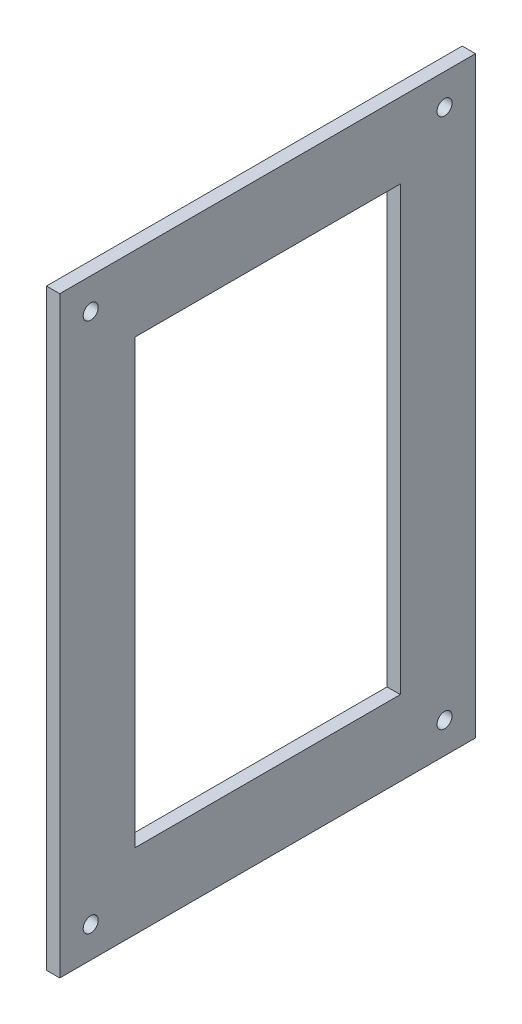
ISO-10303-21;
HEADER;
FILE_DESCRIPTION(('STEP AP214'),'2;1');
FILE_NAME('part.step','',(''),(''),'','','');
FILE_SCHEMA(('AUTOMOTIVE_DESIGN { 1 0 10303 214 1 1 1 1 }'));
ENDSEC;
DATA;
#1=APPLICATION_CONTEXT('core data for automotive mechanical design processes');
#2=APPLICATION_PROTOCOL_DEFINITION('international standard','automotive_design',2000,#1);
#3=PRODUCT_CONTEXT('',#1,'mechanical');
#4=PRODUCT('Part','Part','',(#3));
#5=PRODUCT_RELATED_PRODUCT_CATEGORY('part','',(#4));
#6=PRODUCT_DEFINITION_FORMATION('','',#4);
#7=PRODUCT_DEFINITION_CONTEXT('part definition',#1,'design');
#8=PRODUCT_DEFINITION('design','',#6,#7);
#9=PRODUCT_DEFINITION_SHAPE('','',#8);
#10=(LENGTH_UNIT() NAMED_UNIT(*) SI_UNIT(.MILLI.,.METRE.));
#11=(NAMED_UNIT(*) PLANE_ANGLE_UNIT() SI_UNIT($,.RADIAN.));
#12=(NAMED_UNIT(*) SI_UNIT($,.STERADIAN.) SOLID_ANGLE_UNIT());
#13=UNCERTAINTY_MEASURE_WITH_UNIT(LENGTH_MEASURE(1.E-05),#10,'distance_accuracy_value','');
#14=(GEOMETRIC_REPRESENTATION_CONTEXT(3) GLOBAL_UNCERTAINTY_ASSIGNED_CONTEXT((#13)) GLOBAL_UNIT_ASSIGNED_CONTEXT((#10,
#11,#12)) REPRESENTATION_CONTEXT('',''));
#15=CARTESIAN_POINT('',(0.,0.,0.));
#16=DIRECTION('',(0.,0.,1.));
#17=DIRECTION('',(1.,0.,0.));
#18=AXIS2_PLACEMENT_3D('',#15,#16,#17);
#19=CARTESIAN_POINT('',(101.,0.,0.));
#20=DIRECTION('',(1.,0.,0.));
#21=DIRECTION('',(0.,0.,-1.));
#22=AXIS2_PLACEMENT_3D('',#19,#20,#21);
#23=PLANE('',#22);
#24=CARTESIAN_POINT('',(101.,200.,-40.));
#25=DIRECTION('',(1.,0.,0.));
#26=DIRECTION('',(0.,0.,-1.));
#27=AXIS2_PLACEMENT_3D('',#24,#25,#26);
#28=CIRCLE('',#27,1.7);
#29=CARTESIAN_POINT('',(101.,200.,-41.7));
#30=VERTEX_POINT('',#29);
#31=EDGE_CURVE('E320',#30,#30,#28,.T.);
#32=ORIENTED_EDGE('',*,*,#31,.F.);
#33=EDGE_LOOP('',(#32));
#34=FACE_BOUND('',#33,.T.);
#35=CARTESIAN_POINT('',(101.,80.,-40.));
#36=DIRECTION('',(1.,0.,0.));
#37=DIRECTION('',(0.,0.,-1.));
#38=AXIS2_PLACEMENT_3D('',#35,#36,#37);
#39=CIRCLE('',#38,1.7);
#40=CARTESIAN_POINT('',(101.,80.,-41.7));
#41=VERTEX_POINT('',#40);
#42=EDGE_CURVE('E123',#41,#41,#39,.T.);
#43=ORIENTED_EDGE('',*,*,#42,.F.);
#44=EDGE_LOOP('',(#43));
#45=FACE_BOUND('',#44,.T.);
#46=DIRECTION('',(0.,-1.,0.));
#47=VECTOR('',#46,1.);
#48=CARTESIAN_POINT('',(101.,73.,47.));
#49=LINE('',#48,#47);
#50=CARTESIAN_POINT('',(101.,207.,47.));
#51=VERTEX_POINT('',#50);
#52=CARTESIAN_POINT('',(101.,73.,47.));
#53=VERTEX_POINT('',#52);
#54=EDGE_CURVE('E136',#51,#53,#49,.T.);
#55=ORIENTED_EDGE('',*,*,#54,.T.);
#56=DIRECTION('',(0.,0.,-1.));
#57=VECTOR('',#56,1.);
#58=CARTESIAN_POINT('',(101.,73.,-47.));
#59=LINE('',#58,#57);
#60=CARTESIAN_POINT('',(101.,73.,-47.));
#61=VERTEX_POINT('',#60);
#62=EDGE_CURVE('E139',#53,#61,#59,.T.);
#63=ORIENTED_EDGE('',*,*,#62,.T.);
#64=DIRECTION('',(0.,1.,0.));
#65=VECTOR('',#64,1.);
#66=CARTESIAN_POINT('',(101.,73.,-47.));
#67=LINE('',#66,#65);
#68=CARTESIAN_POINT('',(101.,207.,-47.));
#69=VERTEX_POINT('',#68);
#70=EDGE_CURVE('E142',#61,#69,#67,.T.);
#71=ORIENTED_EDGE('',*,*,#70,.T.);
#72=DIRECTION('',(0.,0.,1.));
#73=VECTOR('',#72,1.);
#74=CARTESIAN_POINT('',(101.,207.,-47.));
#75=LINE('',#74,#73);
#76=EDGE_CURVE('E144',#69,#51,#75,.T.);
#77=ORIENTED_EDGE('',*,*,#76,.T.);
#78=EDGE_LOOP('',(#55,#63,#71,#77));
#79=FACE_BOUND('',#78,.T.);
#80=DIRECTION('',(0.,0.,-1.));
#81=VECTOR('',#80,1.);
#82=CARTESIAN_POINT('',(101.,90.,-30.));
#83=LINE('',#82,#81);
#84=CARTESIAN_POINT('',(101.,90.,30.));
#85=VERTEX_POINT('',#84);
#86=CARTESIAN_POINT('',(101.,90.,-30.));
#87=VERTEX_POINT('',#86);
#88=EDGE_CURVE('E111',#85,#87,#83,.T.);
#89=ORIENTED_EDGE('',*,*,#88,.F.);
#90=DIRECTION('',(0.,-1.,0.));
#91=VECTOR('',#90,1.);
#92=CARTESIAN_POINT('',(101.,90.,30.));
#93=LINE('',#92,#91);
#94=CARTESIAN_POINT('',(101.,190.,30.));
#95=VERTEX_POINT('',#94);
#96=EDGE_CURVE('E119',#95,#85,#93,.T.);
#97=ORIENTED_EDGE('',*,*,#96,.F.);
#98=DIRECTION('',(0.,0.,1.));
#99=VECTOR('',#98,1.);
#100=CARTESIAN_POINT('',(101.,190.,-30.));
#101=LINE('',#100,#99);
#102=CARTESIAN_POINT('',(101.,190.,-30.));
#103=VERTEX_POINT('',#102);
#104=EDGE_CURVE('E127',#103,#95,#101,.T.);
#105=ORIENTED_EDGE('',*,*,#104,.F.);
#106=DIRECTION('',(0.,1.,0.));
#107=VECTOR('',#106,1.);
#108=CARTESIAN_POINT('',(101.,90.,-30.));
#109=LINE('',#108,#107);
#110=EDGE_CURVE('E56',#87,#103,#109,.T.);
#111=ORIENTED_EDGE('',*,*,#110,.F.);
#112=EDGE_LOOP('',(#89,#97,#105,#111));
#113=FACE_BOUND('',#112,.T.);
#114=CARTESIAN_POINT('',(101.,80.,40.));
#115=DIRECTION('',(1.,0.,0.));
#116=DIRECTION('',(0.,0.,-1.));
#117=AXIS2_PLACEMENT_3D('',#114,#115,#116);
#118=CIRCLE('',#117,1.7);
#119=CARTESIAN_POINT('',(101.,80.,38.3));
#120=VERTEX_POINT('',#119);
#121=EDGE_CURVE('E322',#120,#120,#118,.T.);
#122=ORIENTED_EDGE('',*,*,#121,.F.);
#123=EDGE_LOOP('',(#122));
#124=FACE_BOUND('',#123,.T.);
#125=CARTESIAN_POINT('',(101.,200.,40.));
#126=DIRECTION('',(1.,0.,0.));
#127=DIRECTION('',(0.,0.,-1.));
#128=AXIS2_PLACEMENT_3D('',#125,#126,#127);
#129=CIRCLE('',#128,1.7);
#130=CARTESIAN_POINT('',(101.,200.,38.3));
#131=VERTEX_POINT('',#130);
#132=EDGE_CURVE('E318',#131,#131,#129,.T.);
#133=ORIENTED_EDGE('',*,*,#132,.F.);
#134=EDGE_LOOP('',(#133));
#135=FACE_BOUND('',#134,.T.);
#136=ADVANCED_FACE('F39',(#34,#45,#79,#113,#124,#135),#23,.T.);
#137=CARTESIAN_POINT('',(98.,0.,0.));
#138=DIRECTION('',(1.,0.,0.));
#139=DIRECTION('',(0.,0.,-1.));
#140=AXIS2_PLACEMENT_3D('',#137,#138,#139);
#141=PLANE('',#140);
#142=DIRECTION('',(0.,-1.,0.));
#143=VECTOR('',#142,1.);
#144=CARTESIAN_POINT('',(98.,73.,47.));
#145=LINE('',#144,#143);
#146=CARTESIAN_POINT('',(98.,207.,47.));
#147=VERTEX_POINT('',#146);
#148=CARTESIAN_POINT('',(98.,73.,47.));
#149=VERTEX_POINT('',#148);
#150=EDGE_CURVE('E147',#147,#149,#145,.T.);
#151=ORIENTED_EDGE('',*,*,#150,.F.);
#152=DIRECTION('',(0.,0.,1.));
#153=VECTOR('',#152,1.);
#154=CARTESIAN_POINT('',(98.,207.,-47.));
#155=LINE('',#154,#153);
#156=CARTESIAN_POINT('',(98.,207.,-47.));
#157=VERTEX_POINT('',#156);
#158=EDGE_CURVE('E140',#157,#147,#155,.T.);
#159=ORIENTED_EDGE('',*,*,#158,.F.);
#160=DIRECTION('',(0.,1.,0.));
#161=VECTOR('',#160,1.);
#162=CARTESIAN_POINT('',(98.,73.,-47.));
#163=LINE('',#162,#161);
#164=CARTESIAN_POINT('',(98.,73.,-47.));
#165=VERTEX_POINT('',#164);
#166=EDGE_CURVE('E152',#165,#157,#163,.T.);
#167=ORIENTED_EDGE('',*,*,#166,.F.);
#168=DIRECTION('',(0.,0.,-1.));
#169=VECTOR('',#168,1.);
#170=CARTESIAN_POINT('',(98.,73.,-47.));
#171=LINE('',#170,#169);
#172=EDGE_CURVE('E150',#149,#165,#171,.T.);
#173=ORIENTED_EDGE('',*,*,#172,.F.);
#174=EDGE_LOOP('',(#151,#159,#167,#173));
#175=FACE_BOUND('',#174,.T.);
#176=DIRECTION('',(0.,1.,0.));
#177=VECTOR('',#176,1.);
#178=CARTESIAN_POINT('',(98.,0.,30.));
#179=LINE('',#178,#177);
#180=CARTESIAN_POINT('',(98.,90.,30.));
#181=VERTEX_POINT('',#180);
#182=CARTESIAN_POINT('',(98.,190.,30.));
#183=VERTEX_POINT('',#182);
#184=EDGE_CURVE('E11',#181,#183,#179,.T.);
#185=ORIENTED_EDGE('',*,*,#184,.F.);
#186=DIRECTION('',(0.,0.,1.));
#187=VECTOR('',#186,1.);
#188=CARTESIAN_POINT('',(98.,90.,0.));
#189=LINE('',#188,#187);
#190=CARTESIAN_POINT('',(98.,90.,-30.));
#191=VERTEX_POINT('',#190);
#192=EDGE_CURVE('E48',#191,#181,#189,.T.);
#193=ORIENTED_EDGE('',*,*,#192,.F.);
#194=DIRECTION('',(0.,-1.,0.));
#195=VECTOR('',#194,1.);
#196=CARTESIAN_POINT('',(98.,0.,-30.));
#197=LINE('',#196,#195);
#198=CARTESIAN_POINT('',(98.,190.,-30.));
#199=VERTEX_POINT('',#198);
#200=EDGE_CURVE('E168',#199,#191,#197,.T.);
#201=ORIENTED_EDGE('',*,*,#200,.F.);
#202=DIRECTION('',(0.,0.,-1.));
#203=VECTOR('',#202,1.);
#204=CARTESIAN_POINT('',(98.,190.,0.));
#205=LINE('',#204,#203);
#206=EDGE_CURVE('E166',#183,#199,#205,.T.);
#207=ORIENTED_EDGE('',*,*,#206,.F.);
#208=EDGE_LOOP('',(#185,#193,#201,#207));
#209=FACE_BOUND('',#208,.T.);
#210=CARTESIAN_POINT('',(98.,80.,-40.));
#211=DIRECTION('',(1.,0.,0.));
#212=DIRECTION('',(0.,0.,-1.));
#213=AXIS2_PLACEMENT_3D('',#210,#211,#212);
#214=CIRCLE('',#213,1.7);
#215=CARTESIAN_POINT('',(98.,80.,-41.7));
#216=VERTEX_POINT('',#215);
#217=EDGE_CURVE('E115',#216,#216,#214,.F.);
#218=ORIENTED_EDGE('',*,*,#217,.F.);
#219=EDGE_LOOP('',(#218));
#220=FACE_BOUND('',#219,.T.);
#221=CARTESIAN_POINT('',(98.,80.,40.));
#222=DIRECTION('',(1.,0.,0.));
#223=DIRECTION('',(0.,0.,-1.));
#224=AXIS2_PLACEMENT_3D('',#221,#222,#223);
#225=CIRCLE('',#224,1.7);
#226=CARTESIAN_POINT('',(98.,80.,38.3));
#227=VERTEX_POINT('',#226);
#228=EDGE_CURVE('E173',#227,#227,#225,.F.);
#229=ORIENTED_EDGE('',*,*,#228,.F.);
#230=EDGE_LOOP('',(#229));
#231=FACE_BOUND('',#230,.T.);
#232=CARTESIAN_POINT('',(98.,200.,-40.));
#233=DIRECTION('',(1.,0.,0.));
#234=DIRECTION('',(0.,0.,-1.));
#235=AXIS2_PLACEMENT_3D('',#232,#233,#234);
#236=CIRCLE('',#235,1.7);
#237=CARTESIAN_POINT('',(98.,200.,-41.7));
#238=VERTEX_POINT('',#237);
#239=EDGE_CURVE('E175',#238,#238,#236,.F.);
#240=ORIENTED_EDGE('',*,*,#239,.F.);
#241=EDGE_LOOP('',(#240));
#242=FACE_BOUND('',#241,.T.);
#243=CARTESIAN_POINT('',(98.,200.,40.));
#244=DIRECTION('',(1.,0.,0.));
#245=DIRECTION('',(0.,0.,-1.));
#246=AXIS2_PLACEMENT_3D('',#243,#244,#245);
#247=CIRCLE('',#246,1.7);
#248=CARTESIAN_POINT('',(98.,200.,38.3));
#249=VERTEX_POINT('',#248);
#250=EDGE_CURVE('E43',#249,#249,#247,.F.);
#251=ORIENTED_EDGE('',*,*,#250,.F.);
#252=EDGE_LOOP('',(#251));
#253=FACE_BOUND('',#252,.T.);
#254=ADVANCED_FACE('F184',(#175,#209,#220,#231,#242,#253),#141,.F.);
#255=CARTESIAN_POINT('',(101.,73.,47.));
#256=DIRECTION('',(0.,0.,-1.));
#257=DIRECTION('',(-1.,0.,0.));
#258=AXIS2_PLACEMENT_3D('',#255,#256,#257);
#259=PLANE('',#258);
#260=ORIENTED_EDGE('',*,*,#150,.T.);
#261=DIRECTION('',(-1.,0.,0.));
#262=VECTOR('',#261,1.);
#263=CARTESIAN_POINT('',(101.,73.,47.));
#264=LINE('',#263,#262);
#265=EDGE_CURVE('E163',#53,#149,#264,.T.);
#266=ORIENTED_EDGE('',*,*,#265,.F.);
#267=ORIENTED_EDGE('',*,*,#54,.F.);
#268=DIRECTION('',(-1.,0.,0.));
#269=VECTOR('',#268,1.);
#270=CARTESIAN_POINT('',(101.,207.,47.));
#271=LINE('',#270,#269);
#272=EDGE_CURVE('E146',#51,#147,#271,.T.);
#273=ORIENTED_EDGE('',*,*,#272,.T.);
#274=EDGE_LOOP('',(#260,#266,#267,#273));
#275=FACE_BOUND('',#274,.T.);
#276=ADVANCED_FACE('F41',(#275),#259,.F.);
#277=CARTESIAN_POINT('',(101.,73.,-47.));
#278=DIRECTION('',(0.,1.,0.));
#279=DIRECTION('',(0.,0.,1.));
#280=AXIS2_PLACEMENT_3D('',#277,#278,#279);
#281=PLANE('',#280);
#282=ORIENTED_EDGE('',*,*,#172,.T.);
#283=DIRECTION('',(-1.,0.,0.));
#284=VECTOR('',#283,1.);
#285=CARTESIAN_POINT('',(101.,73.,-47.));
#286=LINE('',#285,#284);
#287=EDGE_CURVE('E160',#61,#165,#286,.T.);
#288=ORIENTED_EDGE('',*,*,#287,.F.);
#289=ORIENTED_EDGE('',*,*,#62,.F.);
#290=ORIENTED_EDGE('',*,*,#265,.T.);
#291=EDGE_LOOP('',(#282,#288,#289,#290));
#292=FACE_BOUND('',#291,.T.);
#293=ADVANCED_FACE('F193',(#292),#281,.F.);
#294=CARTESIAN_POINT('',(101.,73.,-47.));
#295=DIRECTION('',(0.,0.,1.));
#296=DIRECTION('',(1.,0.,0.));
#297=AXIS2_PLACEMENT_3D('',#294,#295,#296);
#298=PLANE('',#297);
#299=ORIENTED_EDGE('',*,*,#166,.T.);
#300=DIRECTION('',(-1.,0.,0.));
#301=VECTOR('',#300,1.);
#302=CARTESIAN_POINT('',(101.,207.,-47.));
#303=LINE('',#302,#301);
#304=EDGE_CURVE('E157',#69,#157,#303,.T.);
#305=ORIENTED_EDGE('',*,*,#304,.F.);
#306=ORIENTED_EDGE('',*,*,#70,.F.);
#307=ORIENTED_EDGE('',*,*,#287,.T.);
#308=EDGE_LOOP('',(#299,#305,#306,#307));
#309=FACE_BOUND('',#308,.T.);
#310=ADVANCED_FACE('F204',(#309),#298,.F.);
#311=CARTESIAN_POINT('',(101.,207.,-47.));
#312=DIRECTION('',(0.,-1.,0.));
#313=DIRECTION('',(0.,0.,-1.));
#314=AXIS2_PLACEMENT_3D('',#311,#312,#313);
#315=PLANE('',#314);
#316=ORIENTED_EDGE('',*,*,#158,.T.);
#317=ORIENTED_EDGE('',*,*,#272,.F.);
#318=ORIENTED_EDGE('',*,*,#76,.F.);
#319=ORIENTED_EDGE('',*,*,#304,.T.);
#320=EDGE_LOOP('',(#316,#317,#318,#319));
#321=FACE_BOUND('',#320,.T.);
#322=ADVANCED_FACE('F201',(#321),#315,.F.);
#323=CARTESIAN_POINT('',(98.,90.,30.));
#324=DIRECTION('',(0.,0.,-1.));
#325=DIRECTION('',(-1.,0.,0.));
#326=AXIS2_PLACEMENT_3D('',#323,#324,#325);
#327=PLANE('',#326);
#328=ORIENTED_EDGE('',*,*,#184,.T.);
#329=DIRECTION('',(-1.,0.,0.));
#330=VECTOR('',#329,1.);
#331=CARTESIAN_POINT('',(98.,190.,30.));
#332=LINE('',#331,#330);
#333=EDGE_CURVE('E64',#95,#183,#332,.T.);
#334=ORIENTED_EDGE('',*,*,#333,.F.);
#335=ORIENTED_EDGE('',*,*,#96,.T.);
#336=DIRECTION('',(-1.,0.,0.));
#337=VECTOR('',#336,1.);
#338=CARTESIAN_POINT('',(98.,90.,30.));
#339=LINE('',#338,#337);
#340=EDGE_CURVE('E106',#85,#181,#339,.T.);
#341=ORIENTED_EDGE('',*,*,#340,.T.);
#342=EDGE_LOOP('',(#328,#334,#335,#341));
#343=FACE_BOUND('',#342,.T.);
#344=ADVANCED_FACE('F120',(#343),#327,.T.);
#345=CARTESIAN_POINT('',(98.,90.,-30.));
#346=DIRECTION('',(0.,1.,0.));
#347=DIRECTION('',(0.,0.,1.));
#348=AXIS2_PLACEMENT_3D('',#345,#346,#347);
#349=PLANE('',#348);
#350=ORIENTED_EDGE('',*,*,#192,.T.);
#351=ORIENTED_EDGE('',*,*,#340,.F.);
#352=ORIENTED_EDGE('',*,*,#88,.T.);
#353=DIRECTION('',(-1.,0.,0.));
#354=VECTOR('',#353,1.);
#355=CARTESIAN_POINT('',(98.,90.,-30.));
#356=LINE('',#355,#354);
#357=EDGE_CURVE('E116',#87,#191,#356,.T.);
#358=ORIENTED_EDGE('',*,*,#357,.T.);
#359=EDGE_LOOP('',(#350,#351,#352,#358));
#360=FACE_BOUND('',#359,.T.);
#361=ADVANCED_FACE('F108',(#360),#349,.T.);
#362=CARTESIAN_POINT('',(98.,90.,-30.));
#363=DIRECTION('',(0.,0.,1.));
#364=DIRECTION('',(1.,0.,0.));
#365=AXIS2_PLACEMENT_3D('',#362,#363,#364);
#366=PLANE('',#365);
#367=ORIENTED_EDGE('',*,*,#200,.T.);
#368=ORIENTED_EDGE('',*,*,#357,.F.);
#369=ORIENTED_EDGE('',*,*,#110,.T.);
#370=DIRECTION('',(-1.,0.,0.));
#371=VECTOR('',#370,1.);
#372=CARTESIAN_POINT('',(98.,190.,-30.));
#373=LINE('',#372,#371);
#374=EDGE_CURVE('E133',#103,#199,#373,.T.);
#375=ORIENTED_EDGE('',*,*,#374,.T.);
#376=EDGE_LOOP('',(#367,#368,#369,#375));
#377=FACE_BOUND('',#376,.T.);
#378=ADVANCED_FACE('F255',(#377),#366,.T.);
#379=CARTESIAN_POINT('',(98.,190.,-30.));
#380=DIRECTION('',(0.,-1.,0.));
#381=DIRECTION('',(0.,0.,-1.));
#382=AXIS2_PLACEMENT_3D('',#379,#380,#381);
#383=PLANE('',#382);
#384=ORIENTED_EDGE('',*,*,#206,.T.);
#385=ORIENTED_EDGE('',*,*,#374,.F.);
#386=ORIENTED_EDGE('',*,*,#104,.T.);
#387=ORIENTED_EDGE('',*,*,#333,.T.);
#388=EDGE_LOOP('',(#384,#385,#386,#387));
#389=FACE_BOUND('',#388,.T.);
#390=ADVANCED_FACE('F263',(#389),#383,.T.);
#391=CARTESIAN_POINT('',(98.,80.,-40.));
#392=DIRECTION('',(-1.,0.,0.));
#393=DIRECTION('',(0.,0.,1.));
#394=AXIS2_PLACEMENT_3D('',#391,#392,#393);
#395=CYLINDRICAL_SURFACE('',#394,1.7);
#396=ORIENTED_EDGE('',*,*,#42,.T.);
#397=EDGE_LOOP('',(#396));
#398=FACE_BOUND('',#397,.T.);
#399=ORIENTED_EDGE('',*,*,#217,.T.);
#400=EDGE_LOOP('',(#399));
#401=FACE_BOUND('',#400,.T.);
#402=ADVANCED_FACE('F271',(#398,#401),#395,.F.);
#403=CARTESIAN_POINT('',(98.,80.,40.));
#404=DIRECTION('',(-1.,0.,0.));
#405=DIRECTION('',(0.,0.,1.));
#406=AXIS2_PLACEMENT_3D('',#403,#404,#405);
#407=CYLINDRICAL_SURFACE('',#406,1.7);
#408=ORIENTED_EDGE('',*,*,#121,.T.);
#409=EDGE_LOOP('',(#408));
#410=FACE_BOUND('',#409,.T.);
#411=ORIENTED_EDGE('',*,*,#228,.T.);
#412=EDGE_LOOP('',(#411));
#413=FACE_BOUND('',#412,.T.);
#414=ADVANCED_FACE('F279',(#410,#413),#407,.F.);
#415=CARTESIAN_POINT('',(98.,200.,-40.));
#416=DIRECTION('',(-1.,0.,0.));
#417=DIRECTION('',(0.,0.,1.));
#418=AXIS2_PLACEMENT_3D('',#415,#416,#417);
#419=CYLINDRICAL_SURFACE('',#418,1.7);
#420=ORIENTED_EDGE('',*,*,#31,.T.);
#421=EDGE_LOOP('',(#420));
#422=FACE_BOUND('',#421,.T.);
#423=ORIENTED_EDGE('',*,*,#239,.T.);
#424=EDGE_LOOP('',(#423));
#425=FACE_BOUND('',#424,.T.);
#426=ADVANCED_FACE('F288',(#422,#425),#419,.F.);
#427=CARTESIAN_POINT('',(98.,200.,40.));
#428=DIRECTION('',(-1.,0.,0.));
#429=DIRECTION('',(0.,0.,1.));
#430=AXIS2_PLACEMENT_3D('',#427,#428,#429);
#431=CYLINDRICAL_SURFACE('',#430,1.7);
#432=ORIENTED_EDGE('',*,*,#132,.T.);
#433=EDGE_LOOP('',(#432));
#434=FACE_BOUND('',#433,.T.);
#435=ORIENTED_EDGE('',*,*,#250,.T.);
#436=EDGE_LOOP('',(#435));
#437=FACE_BOUND('',#436,.T.);
#438=ADVANCED_FACE('F182',(#434,#437),#431,.F.);
#439=CLOSED_SHELL('',(#136,#254,#276,#293,#310,#322,#344,#361,#378,#390,#402,#414,#426,#438));
#440=MANIFOLD_SOLID_BREP('B2',#439);
#441=ADVANCED_BREP_SHAPE_REPRESENTATION('',(#18,#440),#14);
#442=SHAPE_DEFINITION_REPRESENTATION(#9,#441);
ENDSEC;
END-ISO-10303-21;
